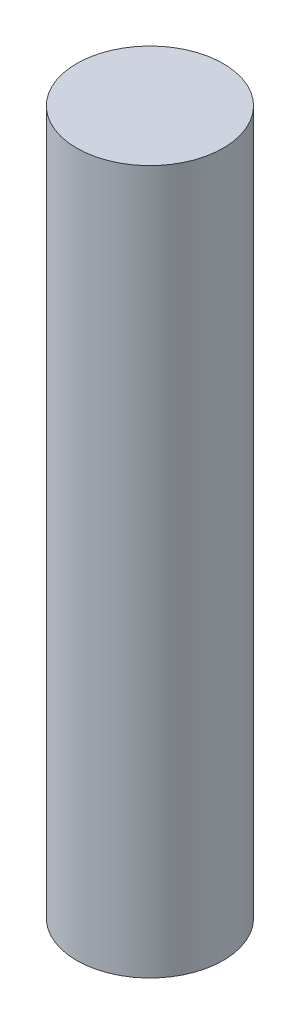
ISO-10303-21;
HEADER;
FILE_DESCRIPTION(('STEP AP214'),'2;1');
FILE_NAME('part.step','',(''),(''),'','','');
FILE_SCHEMA(('AUTOMOTIVE_DESIGN { 1 0 10303 214 1 1 1 1 }'));
ENDSEC;
DATA;
#1=APPLICATION_CONTEXT('core data for automotive mechanical design processes');
#2=APPLICATION_PROTOCOL_DEFINITION('international standard','automotive_design',2000,#1);
#3=PRODUCT_CONTEXT('',#1,'mechanical');
#4=PRODUCT('Part','Part','',(#3));
#5=PRODUCT_RELATED_PRODUCT_CATEGORY('part','',(#4));
#6=PRODUCT_DEFINITION_FORMATION('','',#4);
#7=PRODUCT_DEFINITION_CONTEXT('part definition',#1,'design');
#8=PRODUCT_DEFINITION('design','',#6,#7);
#9=PRODUCT_DEFINITION_SHAPE('','',#8);
#10=(LENGTH_UNIT() NAMED_UNIT(*) SI_UNIT(.MILLI.,.METRE.));
#11=(NAMED_UNIT(*) PLANE_ANGLE_UNIT() SI_UNIT($,.RADIAN.));
#12=(NAMED_UNIT(*) SI_UNIT($,.STERADIAN.) SOLID_ANGLE_UNIT());
#13=UNCERTAINTY_MEASURE_WITH_UNIT(LENGTH_MEASURE(1.E-05),#10,'distance_accuracy_value','');
#14=(GEOMETRIC_REPRESENTATION_CONTEXT(3) GLOBAL_UNCERTAINTY_ASSIGNED_CONTEXT((#13)) GLOBAL_UNIT_ASSIGNED_CONTEXT((#10,
#11,#12)) REPRESENTATION_CONTEXT('',''));
#15=CARTESIAN_POINT('',(0.,0.,0.));
#16=DIRECTION('',(0.,0.,1.));
#17=DIRECTION('',(1.,0.,0.));
#18=AXIS2_PLACEMENT_3D('',#15,#16,#17);
#19=CARTESIAN_POINT('',(0.,24.,0.));
#20=DIRECTION('',(0.,-1.,0.));
#21=DIRECTION('',(0.,0.,-1.));
#22=AXIS2_PLACEMENT_3D('',#19,#20,#21);
#23=CYLINDRICAL_SURFACE('',#22,2.5);
#24=CARTESIAN_POINT('',(0.,24.,0.));
#25=DIRECTION('',(0.,1.,0.));
#26=DIRECTION('',(0.,0.,1.));
#27=AXIS2_PLACEMENT_3D('',#24,#25,#26);
#28=CIRCLE('',#27,2.5);
#29=CARTESIAN_POINT('',(0.,24.,2.5));
#30=VERTEX_POINT('',#29);
#31=EDGE_CURVE('E10',#30,#30,#28,.T.);
#32=ORIENTED_EDGE('',*,*,#31,.F.);
#33=EDGE_LOOP('',(#32));
#34=FACE_BOUND('',#33,.T.);
#35=CARTESIAN_POINT('',(0.,0.,0.));
#36=DIRECTION('',(0.,1.,0.));
#37=DIRECTION('',(0.,0.,1.));
#38=AXIS2_PLACEMENT_3D('',#35,#36,#37);
#39=CIRCLE('',#38,2.5);
#40=CARTESIAN_POINT('',(0.,0.,2.5));
#41=VERTEX_POINT('',#40);
#42=EDGE_CURVE('E35',#41,#41,#39,.T.);
#43=ORIENTED_EDGE('',*,*,#42,.T.);
#44=EDGE_LOOP('',(#43));
#45=FACE_BOUND('',#44,.T.);
#46=ADVANCED_FACE('F32',(#34,#45),#23,.T.);
#47=CARTESIAN_POINT('',(0.,24.,0.));
#48=DIRECTION('',(0.,1.,0.));
#49=DIRECTION('',(0.,0.,1.));
#50=AXIS2_PLACEMENT_3D('',#47,#48,#49);
#51=PLANE('',#50);
#52=ORIENTED_EDGE('',*,*,#31,.T.);
#53=EDGE_LOOP('',(#52));
#54=FACE_BOUND('',#53,.T.);
#55=ADVANCED_FACE('F47',(#54),#51,.T.);
#56=CARTESIAN_POINT('',(0.,0.,0.));
#57=DIRECTION('',(0.,1.,0.));
#58=DIRECTION('',(0.,0.,1.));
#59=AXIS2_PLACEMENT_3D('',#56,#57,#58);
#60=PLANE('',#59);
#61=ORIENTED_EDGE('',*,*,#42,.F.);
#62=EDGE_LOOP('',(#61));
#63=FACE_BOUND('',#62,.T.);
#64=ADVANCED_FACE('F45',(#63),#60,.F.);
#65=CLOSED_SHELL('',(#46,#55,#64));
#66=MANIFOLD_SOLID_BREP('B2',#65);
#67=ADVANCED_BREP_SHAPE_REPRESENTATION('',(#18,#66),#14);
#68=SHAPE_DEFINITION_REPRESENTATION(#9,#67);
ENDSEC;
END-ISO-10303-21;
